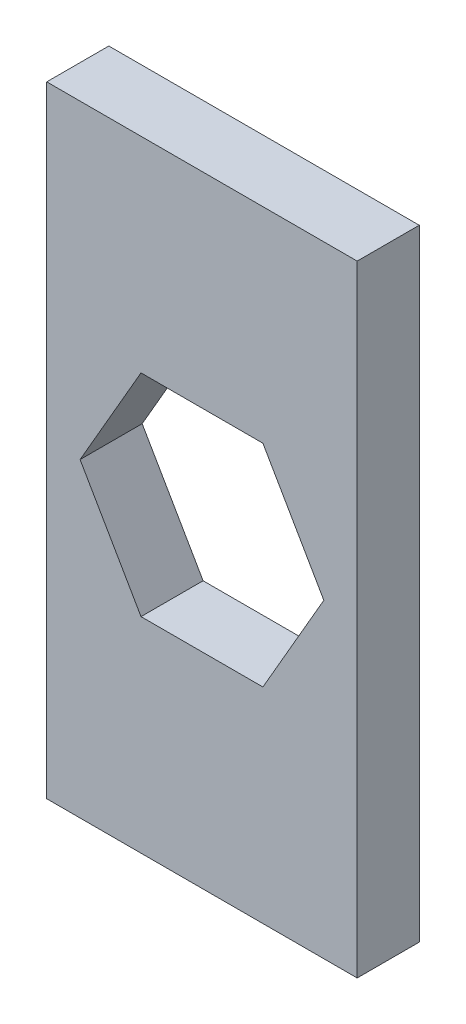
ISO-10303-21;
HEADER;
FILE_DESCRIPTION(('STEP AP214'),'2;1');
FILE_NAME('part.step','',(''),(''),'','','');
FILE_SCHEMA(('AUTOMOTIVE_DESIGN { 1 0 10303 214 1 1 1 1 }'));
ENDSEC;
DATA;
#1=APPLICATION_CONTEXT('core data for automotive mechanical design processes');
#2=APPLICATION_PROTOCOL_DEFINITION('international standard','automotive_design',2000,#1);
#3=PRODUCT_CONTEXT('',#1,'mechanical');
#4=PRODUCT('Part','Part','',(#3));
#5=PRODUCT_RELATED_PRODUCT_CATEGORY('part','',(#4));
#6=PRODUCT_DEFINITION_FORMATION('','',#4);
#7=PRODUCT_DEFINITION_CONTEXT('part definition',#1,'design');
#8=PRODUCT_DEFINITION('design','',#6,#7);
#9=PRODUCT_DEFINITION_SHAPE('','',#8);
#10=(LENGTH_UNIT() NAMED_UNIT(*) SI_UNIT(.MILLI.,.METRE.));
#11=(NAMED_UNIT(*) PLANE_ANGLE_UNIT() SI_UNIT($,.RADIAN.));
#12=(NAMED_UNIT(*) SI_UNIT($,.STERADIAN.) SOLID_ANGLE_UNIT());
#13=UNCERTAINTY_MEASURE_WITH_UNIT(LENGTH_MEASURE(1.E-05),#10,'distance_accuracy_value','');
#14=(GEOMETRIC_REPRESENTATION_CONTEXT(3) GLOBAL_UNCERTAINTY_ASSIGNED_CONTEXT((#13)) GLOBAL_UNIT_ASSIGNED_CONTEXT((#10,
#11,#12)) REPRESENTATION_CONTEXT('',''));
#15=CARTESIAN_POINT('',(0.,0.,0.));
#16=DIRECTION('',(0.,0.,1.));
#17=DIRECTION('',(1.,0.,0.));
#18=AXIS2_PLACEMENT_3D('',#15,#16,#17);
#19=CARTESIAN_POINT('',(0.,0.,2.));
#20=DIRECTION('',(0.,0.,-1.));
#21=DIRECTION('',(-1.,0.,0.));
#22=AXIS2_PLACEMENT_3D('',#19,#20,#21);
#23=PLANE('',#22);
#24=DIRECTION('',(0.,-1.,0.));
#25=VECTOR('',#24,1.);
#26=CARTESIAN_POINT('',(0.,0.,2.));
#27=LINE('',#26,#25);
#28=CARTESIAN_POINT('',(0.,20.,2.));
#29=VERTEX_POINT('',#28);
#30=CARTESIAN_POINT('',(0.,0.,2.));
#31=VERTEX_POINT('',#30);
#32=EDGE_CURVE('E161',#29,#31,#27,.T.);
#33=ORIENTED_EDGE('',*,*,#32,.T.);
#34=DIRECTION('',(1.,0.,0.));
#35=VECTOR('',#34,1.);
#36=CARTESIAN_POINT('',(0.,0.,2.));
#37=LINE('',#36,#35);
#38=CARTESIAN_POINT('',(10.,0.,2.));
#39=VERTEX_POINT('',#38);
#40=EDGE_CURVE('E164',#31,#39,#37,.T.);
#41=ORIENTED_EDGE('',*,*,#40,.T.);
#42=DIRECTION('',(0.,1.,0.));
#43=VECTOR('',#42,1.);
#44=CARTESIAN_POINT('',(10.,0.,2.));
#45=LINE('',#44,#43);
#46=CARTESIAN_POINT('',(10.,20.,2.));
#47=VERTEX_POINT('',#46);
#48=EDGE_CURVE('E167',#39,#47,#45,.T.);
#49=ORIENTED_EDGE('',*,*,#48,.T.);
#50=DIRECTION('',(-1.,0.,0.));
#51=VECTOR('',#50,1.);
#52=CARTESIAN_POINT('',(0.,20.,2.));
#53=LINE('',#52,#51);
#54=EDGE_CURVE('E169',#47,#29,#53,.T.);
#55=ORIENTED_EDGE('',*,*,#54,.T.);
#56=EDGE_LOOP('',(#33,#41,#49,#55));
#57=FACE_BOUND('',#56,.T.);
#58=DIRECTION('',(1.,0.,0.));
#59=VECTOR('',#58,1.);
#60=CARTESIAN_POINT('',(3.03700908475527,6.6,2.));
#61=LINE('',#60,#59);
#62=CARTESIAN_POINT('',(3.03700908475527,6.6,2.));
#63=VERTEX_POINT('',#62);
#64=CARTESIAN_POINT('',(6.96299091524473,6.6,2.));
#65=VERTEX_POINT('',#64);
#66=EDGE_CURVE('E110',#63,#65,#61,.T.);
#67=ORIENTED_EDGE('',*,*,#66,.F.);
#68=DIRECTION('',(0.5,-0.866025403784439,0.));
#69=VECTOR('',#68,1.);
#70=CARTESIAN_POINT('',(1.07401816951055,10.,2.));
#71=LINE('',#70,#69);
#72=CARTESIAN_POINT('',(1.07401816951055,10.,2.));
#73=VERTEX_POINT('',#72);
#74=EDGE_CURVE('E139',#73,#63,#71,.T.);
#75=ORIENTED_EDGE('',*,*,#74,.F.);
#76=DIRECTION('',(-0.5,-0.866025403784439,0.));
#77=VECTOR('',#76,1.);
#78=CARTESIAN_POINT('',(3.03700908475527,13.4,2.));
#79=LINE('',#78,#77);
#80=CARTESIAN_POINT('',(3.03700908475527,13.4,2.));
#81=VERTEX_POINT('',#80);
#82=EDGE_CURVE('E137',#81,#73,#79,.T.);
#83=ORIENTED_EDGE('',*,*,#82,.F.);
#84=DIRECTION('',(-1.,0.,0.));
#85=VECTOR('',#84,1.);
#86=CARTESIAN_POINT('',(6.96299091524472,13.4,2.));
#87=LINE('',#86,#85);
#88=CARTESIAN_POINT('',(6.96299091524472,13.4,2.));
#89=VERTEX_POINT('',#88);
#90=EDGE_CURVE('E133',#89,#81,#87,.T.);
#91=ORIENTED_EDGE('',*,*,#90,.F.);
#92=DIRECTION('',(-0.5,0.866025403784439,0.));
#93=VECTOR('',#92,1.);
#94=CARTESIAN_POINT('',(8.92598183048945,10.,2.));
#95=LINE('',#94,#93);
#96=CARTESIAN_POINT('',(8.92598183048945,10.,2.));
#97=VERTEX_POINT('',#96);
#98=EDGE_CURVE('E131',#97,#89,#95,.T.);
#99=ORIENTED_EDGE('',*,*,#98,.F.);
#100=DIRECTION('',(0.5,0.866025403784439,0.));
#101=VECTOR('',#100,1.);
#102=CARTESIAN_POINT('',(6.96299091524473,6.6,2.));
#103=LINE('',#102,#101);
#104=EDGE_CURVE('E118',#65,#97,#103,.T.);
#105=ORIENTED_EDGE('',*,*,#104,.F.);
#106=EDGE_LOOP('',(#67,#75,#83,#91,#99,#105));
#107=FACE_BOUND('',#106,.T.);
#108=ADVANCED_FACE('F33',(#57,#107),#23,.F.);
#109=CARTESIAN_POINT('',(0.,0.,0.));
#110=DIRECTION('',(0.,0.,-1.));
#111=DIRECTION('',(-1.,0.,0.));
#112=AXIS2_PLACEMENT_3D('',#109,#110,#111);
#113=PLANE('',#112);
#114=DIRECTION('',(0.,-1.,0.));
#115=VECTOR('',#114,1.);
#116=CARTESIAN_POINT('',(0.,0.,0.));
#117=LINE('',#116,#115);
#118=CARTESIAN_POINT('',(0.,20.,0.));
#119=VERTEX_POINT('',#118);
#120=CARTESIAN_POINT('',(0.,0.,0.));
#121=VERTEX_POINT('',#120);
#122=EDGE_CURVE('E126',#119,#121,#117,.T.);
#123=ORIENTED_EDGE('',*,*,#122,.F.);
#124=DIRECTION('',(-1.,0.,0.));
#125=VECTOR('',#124,1.);
#126=CARTESIAN_POINT('',(0.,20.,0.));
#127=LINE('',#126,#125);
#128=CARTESIAN_POINT('',(10.,20.,0.));
#129=VERTEX_POINT('',#128);
#130=EDGE_CURVE('E165',#129,#119,#127,.T.);
#131=ORIENTED_EDGE('',*,*,#130,.F.);
#132=DIRECTION('',(0.,1.,0.));
#133=VECTOR('',#132,1.);
#134=CARTESIAN_POINT('',(10.,0.,0.));
#135=LINE('',#134,#133);
#136=CARTESIAN_POINT('',(10.,0.,0.));
#137=VERTEX_POINT('',#136);
#138=EDGE_CURVE('E176',#137,#129,#135,.T.);
#139=ORIENTED_EDGE('',*,*,#138,.F.);
#140=DIRECTION('',(1.,0.,0.));
#141=VECTOR('',#140,1.);
#142=CARTESIAN_POINT('',(0.,0.,0.));
#143=LINE('',#142,#141);
#144=EDGE_CURVE('E174',#121,#137,#143,.T.);
#145=ORIENTED_EDGE('',*,*,#144,.F.);
#146=EDGE_LOOP('',(#123,#131,#139,#145));
#147=FACE_BOUND('',#146,.T.);
#148=DIRECTION('',(0.5,-0.866025403784439,0.));
#149=VECTOR('',#148,1.);
#150=CARTESIAN_POINT('',(1.07401816951055,10.,0.));
#151=LINE('',#150,#149);
#152=CARTESIAN_POINT('',(1.07401816951055,10.,0.));
#153=VERTEX_POINT('',#152);
#154=CARTESIAN_POINT('',(3.03700908475527,6.6,0.));
#155=VERTEX_POINT('',#154);
#156=EDGE_CURVE('E119',#153,#155,#151,.T.);
#157=ORIENTED_EDGE('',*,*,#156,.T.);
#158=DIRECTION('',(1.,0.,0.));
#159=VECTOR('',#158,1.);
#160=CARTESIAN_POINT('',(3.03700908475527,6.6,0.));
#161=LINE('',#160,#159);
#162=CARTESIAN_POINT('',(6.96299091524473,6.6,0.));
#163=VERTEX_POINT('',#162);
#164=EDGE_CURVE('E56',#155,#163,#161,.T.);
#165=ORIENTED_EDGE('',*,*,#164,.T.);
#166=DIRECTION('',(0.5,0.866025403784439,0.));
#167=VECTOR('',#166,1.);
#168=CARTESIAN_POINT('',(6.96299091524473,6.6,0.));
#169=LINE('',#168,#167);
#170=CARTESIAN_POINT('',(8.92598183048945,10.,0.));
#171=VERTEX_POINT('',#170);
#172=EDGE_CURVE('E125',#163,#171,#169,.T.);
#173=ORIENTED_EDGE('',*,*,#172,.T.);
#174=DIRECTION('',(-0.5,0.866025403784439,0.));
#175=VECTOR('',#174,1.);
#176=CARTESIAN_POINT('',(8.92598183048945,10.,0.));
#177=LINE('',#176,#175);
#178=CARTESIAN_POINT('',(6.96299091524472,13.4,0.));
#179=VERTEX_POINT('',#178);
#180=EDGE_CURVE('E143',#171,#179,#177,.T.);
#181=ORIENTED_EDGE('',*,*,#180,.T.);
#182=DIRECTION('',(-1.,0.,0.));
#183=VECTOR('',#182,1.);
#184=CARTESIAN_POINT('',(6.96299091524472,13.4,0.));
#185=LINE('',#184,#183);
#186=CARTESIAN_POINT('',(3.03700908475527,13.4,0.));
#187=VERTEX_POINT('',#186);
#188=EDGE_CURVE('E146',#179,#187,#185,.T.);
#189=ORIENTED_EDGE('',*,*,#188,.T.);
#190=DIRECTION('',(-0.5,-0.866025403784439,0.));
#191=VECTOR('',#190,1.);
#192=CARTESIAN_POINT('',(3.03700908475527,13.4,0.));
#193=LINE('',#192,#191);
#194=EDGE_CURVE('E149',#187,#153,#193,.T.);
#195=ORIENTED_EDGE('',*,*,#194,.T.);
#196=EDGE_LOOP('',(#157,#165,#173,#181,#189,#195));
#197=FACE_BOUND('',#196,.T.);
#198=ADVANCED_FACE('F194',(#147,#197),#113,.T.);
#199=CARTESIAN_POINT('',(0.,0.,2.));
#200=DIRECTION('',(1.,0.,0.));
#201=DIRECTION('',(0.,1.,0.));
#202=AXIS2_PLACEMENT_3D('',#199,#200,#201);
#203=PLANE('',#202);
#204=ORIENTED_EDGE('',*,*,#122,.T.);
#205=DIRECTION('',(0.,0.,-1.));
#206=VECTOR('',#205,1.);
#207=CARTESIAN_POINT('',(0.,0.,2.));
#208=LINE('',#207,#206);
#209=EDGE_CURVE('E11',#31,#121,#208,.T.);
#210=ORIENTED_EDGE('',*,*,#209,.F.);
#211=ORIENTED_EDGE('',*,*,#32,.F.);
#212=DIRECTION('',(0.,0.,-1.));
#213=VECTOR('',#212,1.);
#214=CARTESIAN_POINT('',(0.,20.,2.));
#215=LINE('',#214,#213);
#216=EDGE_CURVE('E171',#29,#119,#215,.T.);
#217=ORIENTED_EDGE('',*,*,#216,.T.);
#218=EDGE_LOOP('',(#204,#210,#211,#217));
#219=FACE_BOUND('',#218,.T.);
#220=ADVANCED_FACE('F35',(#219),#203,.F.);
#221=CARTESIAN_POINT('',(0.,0.,2.));
#222=DIRECTION('',(0.,1.,0.));
#223=DIRECTION('',(0.,0.,1.));
#224=AXIS2_PLACEMENT_3D('',#221,#222,#223);
#225=PLANE('',#224);
#226=ORIENTED_EDGE('',*,*,#144,.T.);
#227=DIRECTION('',(0.,0.,-1.));
#228=VECTOR('',#227,1.);
#229=CARTESIAN_POINT('',(10.,0.,2.));
#230=LINE('',#229,#228);
#231=EDGE_CURVE('E41',#39,#137,#230,.T.);
#232=ORIENTED_EDGE('',*,*,#231,.F.);
#233=ORIENTED_EDGE('',*,*,#40,.F.);
#234=ORIENTED_EDGE('',*,*,#209,.T.);
#235=EDGE_LOOP('',(#226,#232,#233,#234));
#236=FACE_BOUND('',#235,.T.);
#237=ADVANCED_FACE('F204',(#236),#225,.F.);
#238=CARTESIAN_POINT('',(10.,0.,2.));
#239=DIRECTION('',(-1.,0.,0.));
#240=DIRECTION('',(0.,-1.,0.));
#241=AXIS2_PLACEMENT_3D('',#238,#239,#240);
#242=PLANE('',#241);
#243=ORIENTED_EDGE('',*,*,#138,.T.);
#244=DIRECTION('',(0.,0.,-1.));
#245=VECTOR('',#244,1.);
#246=CARTESIAN_POINT('',(10.,20.,2.));
#247=LINE('',#246,#245);
#248=EDGE_CURVE('E181',#47,#129,#247,.T.);
#249=ORIENTED_EDGE('',*,*,#248,.F.);
#250=ORIENTED_EDGE('',*,*,#48,.F.);
#251=ORIENTED_EDGE('',*,*,#231,.T.);
#252=EDGE_LOOP('',(#243,#249,#250,#251));
#253=FACE_BOUND('',#252,.T.);
#254=ADVANCED_FACE('F188',(#253),#242,.F.);
#255=CARTESIAN_POINT('',(0.,20.,2.));
#256=DIRECTION('',(0.,-1.,0.));
#257=DIRECTION('',(0.,0.,-1.));
#258=AXIS2_PLACEMENT_3D('',#255,#256,#257);
#259=PLANE('',#258);
#260=ORIENTED_EDGE('',*,*,#130,.T.);
#261=ORIENTED_EDGE('',*,*,#216,.F.);
#262=ORIENTED_EDGE('',*,*,#54,.F.);
#263=ORIENTED_EDGE('',*,*,#248,.T.);
#264=EDGE_LOOP('',(#260,#261,#262,#263));
#265=FACE_BOUND('',#264,.T.);
#266=ADVANCED_FACE('F198',(#265),#259,.F.);
#267=CARTESIAN_POINT('',(3.03700908475527,6.6,2.));
#268=DIRECTION('',(0.,1.,0.));
#269=DIRECTION('',(-1.,0.,0.));
#270=AXIS2_PLACEMENT_3D('',#267,#268,#269);
#271=PLANE('',#270);
#272=ORIENTED_EDGE('',*,*,#164,.F.);
#273=DIRECTION('',(0.,0.,-1.));
#274=VECTOR('',#273,1.);
#275=CARTESIAN_POINT('',(3.03700908475527,6.6,2.));
#276=LINE('',#275,#274);
#277=EDGE_CURVE('E114',#63,#155,#276,.T.);
#278=ORIENTED_EDGE('',*,*,#277,.F.);
#279=ORIENTED_EDGE('',*,*,#66,.T.);
#280=DIRECTION('',(0.,0.,-1.));
#281=VECTOR('',#280,1.);
#282=CARTESIAN_POINT('',(6.96299091524473,6.6,2.));
#283=LINE('',#282,#281);
#284=EDGE_CURVE('E113',#65,#163,#283,.T.);
#285=ORIENTED_EDGE('',*,*,#284,.T.);
#286=EDGE_LOOP('',(#272,#278,#279,#285));
#287=FACE_BOUND('',#286,.T.);
#288=ADVANCED_FACE('F112',(#287),#271,.T.);
#289=CARTESIAN_POINT('',(6.96299091524473,6.6,2.));
#290=DIRECTION('',(-0.866025403784439,0.5,0.));
#291=DIRECTION('',(-0.5,-0.866025403784439,0.));
#292=AXIS2_PLACEMENT_3D('',#289,#290,#291);
#293=PLANE('',#292);
#294=ORIENTED_EDGE('',*,*,#172,.F.);
#295=ORIENTED_EDGE('',*,*,#284,.F.);
#296=ORIENTED_EDGE('',*,*,#104,.T.);
#297=DIRECTION('',(0.,0.,-1.));
#298=VECTOR('',#297,1.);
#299=CARTESIAN_POINT('',(8.92598183048945,10.,2.));
#300=LINE('',#299,#298);
#301=EDGE_CURVE('E127',#97,#171,#300,.T.);
#302=ORIENTED_EDGE('',*,*,#301,.T.);
#303=EDGE_LOOP('',(#294,#295,#296,#302));
#304=FACE_BOUND('',#303,.T.);
#305=ADVANCED_FACE('F122',(#304),#293,.T.);
#306=CARTESIAN_POINT('',(8.92598183048945,10.,2.));
#307=DIRECTION('',(-0.866025403784439,-0.5,0.));
#308=DIRECTION('',(0.5,-0.866025403784439,0.));
#309=AXIS2_PLACEMENT_3D('',#306,#307,#308);
#310=PLANE('',#309);
#311=ORIENTED_EDGE('',*,*,#180,.F.);
#312=ORIENTED_EDGE('',*,*,#301,.F.);
#313=ORIENTED_EDGE('',*,*,#98,.T.);
#314=DIRECTION('',(0.,0.,-1.));
#315=VECTOR('',#314,1.);
#316=CARTESIAN_POINT('',(6.96299091524472,13.4,2.));
#317=LINE('',#316,#315);
#318=EDGE_CURVE('E158',#89,#179,#317,.T.);
#319=ORIENTED_EDGE('',*,*,#318,.T.);
#320=EDGE_LOOP('',(#311,#312,#313,#319));
#321=FACE_BOUND('',#320,.T.);
#322=ADVANCED_FACE('F227',(#321),#310,.T.);
#323=CARTESIAN_POINT('',(6.96299091524472,13.4,2.));
#324=DIRECTION('',(0.,-1.,0.));
#325=DIRECTION('',(0.,0.,-1.));
#326=AXIS2_PLACEMENT_3D('',#323,#324,#325);
#327=PLANE('',#326);
#328=ORIENTED_EDGE('',*,*,#188,.F.);
#329=ORIENTED_EDGE('',*,*,#318,.F.);
#330=ORIENTED_EDGE('',*,*,#90,.T.);
#331=DIRECTION('',(0.,0.,-1.));
#332=VECTOR('',#331,1.);
#333=CARTESIAN_POINT('',(3.03700908475527,13.4,2.));
#334=LINE('',#333,#332);
#335=EDGE_CURVE('E156',#81,#187,#334,.T.);
#336=ORIENTED_EDGE('',*,*,#335,.T.);
#337=EDGE_LOOP('',(#328,#329,#330,#336));
#338=FACE_BOUND('',#337,.T.);
#339=ADVANCED_FACE('F231',(#338),#327,.T.);
#340=CARTESIAN_POINT('',(3.03700908475527,13.4,2.));
#341=DIRECTION('',(0.866025403784439,-0.5,0.));
#342=DIRECTION('',(0.5,0.866025403784439,0.));
#343=AXIS2_PLACEMENT_3D('',#340,#341,#342);
#344=PLANE('',#343);
#345=ORIENTED_EDGE('',*,*,#194,.F.);
#346=ORIENTED_EDGE('',*,*,#335,.F.);
#347=ORIENTED_EDGE('',*,*,#82,.T.);
#348=DIRECTION('',(0.,0.,-1.));
#349=VECTOR('',#348,1.);
#350=CARTESIAN_POINT('',(1.07401816951055,10.,2.));
#351=LINE('',#350,#349);
#352=EDGE_CURVE('E48',#73,#153,#351,.T.);
#353=ORIENTED_EDGE('',*,*,#352,.T.);
#354=EDGE_LOOP('',(#345,#346,#347,#353));
#355=FACE_BOUND('',#354,.T.);
#356=ADVANCED_FACE('F237',(#355),#344,.T.);
#357=CARTESIAN_POINT('',(1.07401816951055,10.,2.));
#358=DIRECTION('',(0.866025403784439,0.5,0.));
#359=DIRECTION('',(-0.5,0.866025403784439,0.));
#360=AXIS2_PLACEMENT_3D('',#357,#358,#359);
#361=PLANE('',#360);
#362=ORIENTED_EDGE('',*,*,#156,.F.);
#363=ORIENTED_EDGE('',*,*,#352,.F.);
#364=ORIENTED_EDGE('',*,*,#74,.T.);
#365=ORIENTED_EDGE('',*,*,#277,.T.);
#366=EDGE_LOOP('',(#362,#363,#364,#365));
#367=FACE_BOUND('',#366,.T.);
#368=ADVANCED_FACE('F241',(#367),#361,.T.);
#369=CLOSED_SHELL('',(#108,#198,#220,#237,#254,#266,#288,#305,#322,#339,#356,#368));
#370=MANIFOLD_SOLID_BREP('B2',#369);
#371=ADVANCED_BREP_SHAPE_REPRESENTATION('',(#18,#370),#14);
#372=SHAPE_DEFINITION_REPRESENTATION(#9,#371);
ENDSEC;
END-ISO-10303-21;
